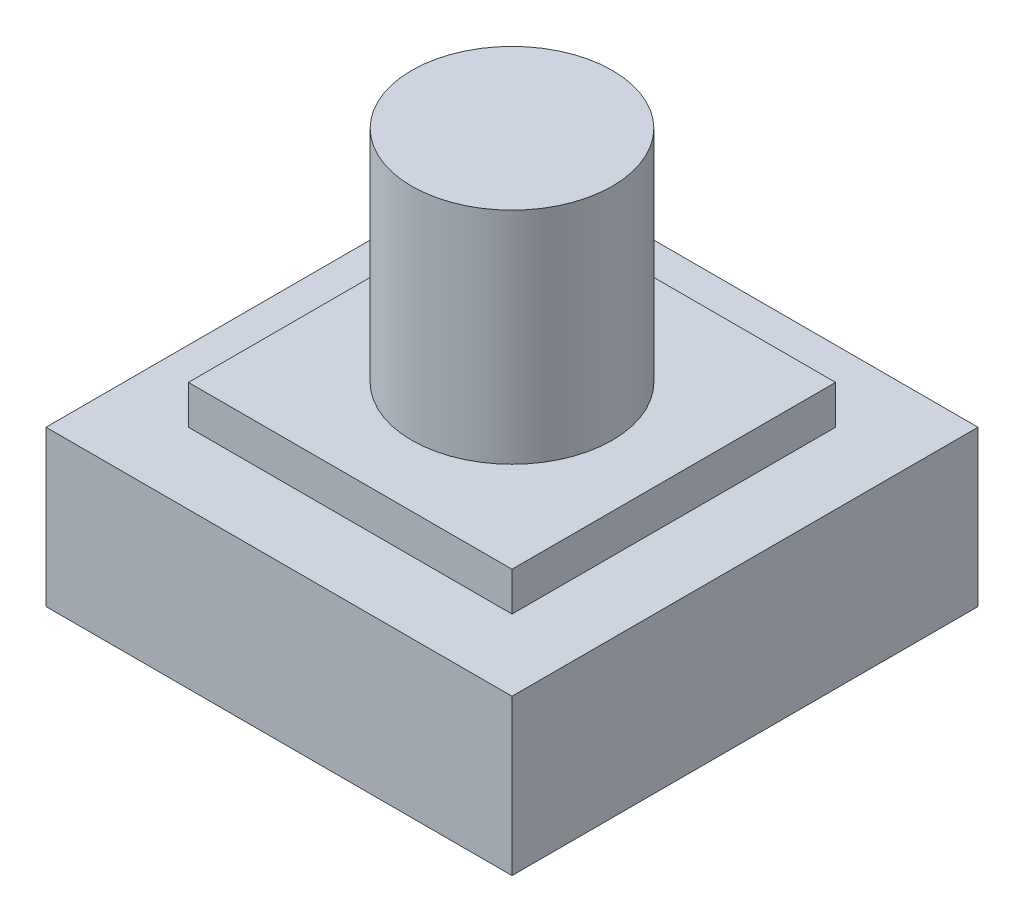
ISO-10303-21;
HEADER;
FILE_DESCRIPTION(('STEP AP214'),'2;1');
FILE_NAME('part.step','',(''),(''),'','','');
FILE_SCHEMA(('AUTOMOTIVE_DESIGN { 1 0 10303 214 1 1 1 1 }'));
ENDSEC;
DATA;
#1=APPLICATION_CONTEXT('core data for automotive mechanical design processes');
#2=APPLICATION_PROTOCOL_DEFINITION('international standard','automotive_design',2000,#1);
#3=PRODUCT_CONTEXT('',#1,'mechanical');
#4=PRODUCT('Part','Part','',(#3));
#5=PRODUCT_RELATED_PRODUCT_CATEGORY('part','',(#4));
#6=PRODUCT_DEFINITION_FORMATION('','',#4);
#7=PRODUCT_DEFINITION_CONTEXT('part definition',#1,'design');
#8=PRODUCT_DEFINITION('design','',#6,#7);
#9=PRODUCT_DEFINITION_SHAPE('','',#8);
#10=(LENGTH_UNIT() NAMED_UNIT(*) SI_UNIT(.MILLI.,.METRE.));
#11=(NAMED_UNIT(*) PLANE_ANGLE_UNIT() SI_UNIT($,.RADIAN.));
#12=(NAMED_UNIT(*) SI_UNIT($,.STERADIAN.) SOLID_ANGLE_UNIT());
#13=UNCERTAINTY_MEASURE_WITH_UNIT(LENGTH_MEASURE(1.E-05),#10,'distance_accuracy_value','');
#14=(GEOMETRIC_REPRESENTATION_CONTEXT(3) GLOBAL_UNCERTAINTY_ASSIGNED_CONTEXT((#13)) GLOBAL_UNIT_ASSIGNED_CONTEXT((#10,
#11,#12)) REPRESENTATION_CONTEXT('',''));
#15=CARTESIAN_POINT('',(0.,0.,0.));
#16=DIRECTION('',(0.,0.,1.));
#17=DIRECTION('',(1.,0.,0.));
#18=AXIS2_PLACEMENT_3D('',#15,#16,#17);
#19=CARTESIAN_POINT('',(0.,32.,0.));
#20=DIRECTION('',(0.,-1.,0.));
#21=DIRECTION('',(0.,0.,-1.));
#22=AXIS2_PLACEMENT_3D('',#19,#20,#21);
#23=CYLINDRICAL_SURFACE('',#22,7.75);
#24=CARTESIAN_POINT('',(0.,32.,0.));
#25=DIRECTION('',(0.,-1.,0.));
#26=DIRECTION('',(0.,0.,-1.));
#27=AXIS2_PLACEMENT_3D('',#24,#25,#26);
#28=CIRCLE('',#27,7.75);
#29=CARTESIAN_POINT('',(0.,32.,-7.75));
#30=VERTEX_POINT('',#29);
#31=EDGE_CURVE('E11',#30,#30,#28,.T.);
#32=ORIENTED_EDGE('',*,*,#31,.T.);
#33=EDGE_LOOP('',(#32));
#34=FACE_BOUND('',#33,.T.);
#35=CARTESIAN_POINT('',(0.,15.,0.));
#36=DIRECTION('',(0.,-1.,0.));
#37=DIRECTION('',(0.,0.,-1.));
#38=AXIS2_PLACEMENT_3D('',#35,#36,#37);
#39=CIRCLE('',#38,7.75);
#40=CARTESIAN_POINT('',(0.,15.,-7.75));
#41=VERTEX_POINT('',#40);
#42=EDGE_CURVE('E43',#41,#41,#39,.T.);
#43=ORIENTED_EDGE('',*,*,#42,.F.);
#44=EDGE_LOOP('',(#43));
#45=FACE_BOUND('',#44,.T.);
#46=ADVANCED_FACE('F40',(#34,#45),#23,.T.);
#47=CARTESIAN_POINT('',(0.,32.,0.));
#48=DIRECTION('',(0.,-1.,0.));
#49=DIRECTION('',(0.,0.,-1.));
#50=AXIS2_PLACEMENT_3D('',#47,#48,#49);
#51=PLANE('',#50);
#52=ORIENTED_EDGE('',*,*,#31,.F.);
#53=EDGE_LOOP('',(#52));
#54=FACE_BOUND('',#53,.T.);
#55=ADVANCED_FACE('F55',(#54),#51,.F.);
#56=CARTESIAN_POINT('',(0.,15.,0.));
#57=DIRECTION('',(0.,-1.,0.));
#58=DIRECTION('',(0.,0.,-1.));
#59=AXIS2_PLACEMENT_3D('',#56,#57,#58);
#60=PLANE('',#59);
#61=ORIENTED_EDGE('',*,*,#42,.T.);
#62=EDGE_LOOP('',(#61));
#63=FACE_BOUND('',#62,.T.);
#64=ADVANCED_FACE('F52',(#63),#60,.T.);
#65=CLOSED_SHELL('',(#46,#55,#64));
#66=MANIFOLD_SOLID_BREP('B2',#65);
#67=CARTESIAN_POINT('',(0.,0.,0.));
#68=DIRECTION('',(0.,1.,0.));
#69=DIRECTION('',(0.,0.,1.));
#70=AXIS2_PLACEMENT_3D('',#67,#68,#69);
#71=PLANE('',#70);
#72=DIRECTION('',(1.,0.,0.));
#73=VECTOR('',#72,1.);
#74=CARTESIAN_POINT('',(0.,0.,18.));
#75=LINE('',#74,#73);
#76=CARTESIAN_POINT('',(-18.,0.,18.));
#77=VERTEX_POINT('',#76);
#78=CARTESIAN_POINT('',(18.,0.,18.));
#79=VERTEX_POINT('',#78);
#80=EDGE_CURVE('E220',#77,#79,#75,.T.);
#81=ORIENTED_EDGE('',*,*,#80,.F.);
#82=DIRECTION('',(0.,0.,-1.));
#83=VECTOR('',#82,1.);
#84=CARTESIAN_POINT('',(-18.,0.,0.));
#85=LINE('',#84,#83);
#86=CARTESIAN_POINT('',(-18.,0.,-18.));
#87=VERTEX_POINT('',#86);
#88=EDGE_CURVE('E233',#77,#87,#85,.T.);
#89=ORIENTED_EDGE('',*,*,#88,.T.);
#90=DIRECTION('',(1.,0.,0.));
#91=VECTOR('',#90,1.);
#92=CARTESIAN_POINT('',(0.,0.,-18.));
#93=LINE('',#92,#91);
#94=CARTESIAN_POINT('',(18.,0.,-18.));
#95=VERTEX_POINT('',#94);
#96=EDGE_CURVE('E247',#87,#95,#93,.T.);
#97=ORIENTED_EDGE('',*,*,#96,.T.);
#98=DIRECTION('',(0.,0.,-1.));
#99=VECTOR('',#98,1.);
#100=CARTESIAN_POINT('',(18.,0.,0.));
#101=LINE('',#100,#99);
#102=EDGE_CURVE('E244',#79,#95,#101,.T.);
#103=ORIENTED_EDGE('',*,*,#102,.F.);
#104=EDGE_LOOP('',(#81,#89,#97,#103));
#105=FACE_BOUND('',#104,.T.);
#106=DIRECTION('',(0.,0.,-1.));
#107=VECTOR('',#106,1.);
#108=CARTESIAN_POINT('',(3.,0.,-11.8));
#109=LINE('',#108,#107);
#110=CARTESIAN_POINT('',(3.,0.,-11.8));
#111=VERTEX_POINT('',#110);
#112=CARTESIAN_POINT('',(3.,0.,-16.5));
#113=VERTEX_POINT('',#112);
#114=EDGE_CURVE('E190',#111,#113,#109,.T.);
#115=ORIENTED_EDGE('',*,*,#114,.F.);
#116=DIRECTION('',(-1.,0.,0.));
#117=VECTOR('',#116,1.);
#118=CARTESIAN_POINT('',(3.,0.,-11.8));
#119=LINE('',#118,#117);
#120=CARTESIAN_POINT('',(12.,0.,-11.8));
#121=VERTEX_POINT('',#120);
#122=EDGE_CURVE('E187',#121,#111,#119,.T.);
#123=ORIENTED_EDGE('',*,*,#122,.F.);
#124=DIRECTION('',(0.,0.,1.));
#125=VECTOR('',#124,1.);
#126=CARTESIAN_POINT('',(12.,0.,-11.8));
#127=LINE('',#126,#125);
#128=CARTESIAN_POINT('',(12.,0.,-16.5));
#129=VERTEX_POINT('',#128);
#130=EDGE_CURVE('E101',#129,#121,#127,.T.);
#131=ORIENTED_EDGE('',*,*,#130,.F.);
#132=DIRECTION('',(1.,0.,0.));
#133=VECTOR('',#132,1.);
#134=CARTESIAN_POINT('',(3.,0.,-16.5));
#135=LINE('',#134,#133);
#136=EDGE_CURVE('E96',#113,#129,#135,.T.);
#137=ORIENTED_EDGE('',*,*,#136,.F.);
#138=EDGE_LOOP('',(#115,#123,#131,#137));
#139=FACE_BOUND('',#138,.T.);
#140=ADVANCED_FACE('F81',(#105,#139),#71,.F.);
#141=CARTESIAN_POINT('',(0.,12.,0.));
#142=DIRECTION('',(0.,1.,0.));
#143=DIRECTION('',(0.,0.,1.));
#144=AXIS2_PLACEMENT_3D('',#141,#142,#143);
#145=PLANE('',#144);
#146=DIRECTION('',(1.,0.,0.));
#147=VECTOR('',#146,1.);
#148=CARTESIAN_POINT('',(0.,12.,18.));
#149=LINE('',#148,#147);
#150=CARTESIAN_POINT('',(-18.,12.,18.));
#151=VERTEX_POINT('',#150);
#152=CARTESIAN_POINT('',(18.,12.,18.));
#153=VERTEX_POINT('',#152);
#154=EDGE_CURVE('E229',#151,#153,#149,.T.);
#155=ORIENTED_EDGE('',*,*,#154,.T.);
#156=DIRECTION('',(0.,0.,-1.));
#157=VECTOR('',#156,1.);
#158=CARTESIAN_POINT('',(18.,12.,0.));
#159=LINE('',#158,#157);
#160=CARTESIAN_POINT('',(18.,12.,-18.));
#161=VERTEX_POINT('',#160);
#162=EDGE_CURVE('E232',#153,#161,#159,.T.);
#163=ORIENTED_EDGE('',*,*,#162,.T.);
#164=DIRECTION('',(1.,0.,0.));
#165=VECTOR('',#164,1.);
#166=CARTESIAN_POINT('',(0.,12.,-18.));
#167=LINE('',#166,#165);
#168=CARTESIAN_POINT('',(-18.,12.,-18.));
#169=VERTEX_POINT('',#168);
#170=EDGE_CURVE('E235',#169,#161,#167,.T.);
#171=ORIENTED_EDGE('',*,*,#170,.F.);
#172=DIRECTION('',(0.,0.,-1.));
#173=VECTOR('',#172,1.);
#174=CARTESIAN_POINT('',(-18.,12.,0.));
#175=LINE('',#174,#173);
#176=EDGE_CURVE('E238',#151,#169,#175,.T.);
#177=ORIENTED_EDGE('',*,*,#176,.F.);
#178=EDGE_LOOP('',(#155,#163,#171,#177));
#179=FACE_BOUND('',#178,.T.);
#180=DIRECTION('',(0.,0.,-1.));
#181=VECTOR('',#180,1.);
#182=CARTESIAN_POINT('',(12.5,12.,0.));
#183=LINE('',#182,#181);
#184=CARTESIAN_POINT('',(12.5,12.,12.5));
#185=VERTEX_POINT('',#184);
#186=CARTESIAN_POINT('',(12.5,12.,-12.5));
#187=VERTEX_POINT('',#186);
#188=EDGE_CURVE('E203',#185,#187,#183,.T.);
#189=ORIENTED_EDGE('',*,*,#188,.F.);
#190=DIRECTION('',(-1.,0.,0.));
#191=VECTOR('',#190,1.);
#192=CARTESIAN_POINT('',(0.,12.,12.5));
#193=LINE('',#192,#191);
#194=CARTESIAN_POINT('',(-12.5,12.,12.5));
#195=VERTEX_POINT('',#194);
#196=EDGE_CURVE('E191',#185,#195,#193,.T.);
#197=ORIENTED_EDGE('',*,*,#196,.T.);
#198=DIRECTION('',(0.,0.,-1.));
#199=VECTOR('',#198,1.);
#200=CARTESIAN_POINT('',(-12.5,12.,0.));
#201=LINE('',#200,#199);
#202=CARTESIAN_POINT('',(-12.5,12.,-12.5));
#203=VERTEX_POINT('',#202);
#204=EDGE_CURVE('E193',#195,#203,#201,.T.);
#205=ORIENTED_EDGE('',*,*,#204,.T.);
#206=DIRECTION('',(-1.,0.,0.));
#207=VECTOR('',#206,1.);
#208=CARTESIAN_POINT('',(0.,12.,-12.5));
#209=LINE('',#208,#207);
#210=EDGE_CURVE('E212',#187,#203,#209,.T.);
#211=ORIENTED_EDGE('',*,*,#210,.F.);
#212=EDGE_LOOP('',(#189,#197,#205,#211));
#213=FACE_BOUND('',#212,.T.);
#214=ADVANCED_FACE('F270',(#179,#213),#145,.T.);
#215=CARTESIAN_POINT('',(0.,12.,18.));
#216=DIRECTION('',(0.,0.,-1.));
#217=DIRECTION('',(-1.,0.,0.));
#218=AXIS2_PLACEMENT_3D('',#215,#216,#217);
#219=PLANE('',#218);
#220=ORIENTED_EDGE('',*,*,#80,.T.);
#221=DIRECTION('',(0.,-1.,0.));
#222=VECTOR('',#221,1.);
#223=CARTESIAN_POINT('',(18.,12.,18.));
#224=LINE('',#223,#222);
#225=EDGE_CURVE('E38',#153,#79,#224,.T.);
#226=ORIENTED_EDGE('',*,*,#225,.F.);
#227=ORIENTED_EDGE('',*,*,#154,.F.);
#228=DIRECTION('',(0.,-1.,0.));
#229=VECTOR('',#228,1.);
#230=CARTESIAN_POINT('',(-18.,12.,18.));
#231=LINE('',#230,#229);
#232=EDGE_CURVE('E241',#151,#77,#231,.T.);
#233=ORIENTED_EDGE('',*,*,#232,.T.);
#234=EDGE_LOOP('',(#220,#226,#227,#233));
#235=FACE_BOUND('',#234,.T.);
#236=ADVANCED_FACE('F83',(#235),#219,.F.);
#237=CARTESIAN_POINT('',(18.,12.,0.));
#238=DIRECTION('',(-1.,0.,0.));
#239=DIRECTION('',(0.,0.,1.));
#240=AXIS2_PLACEMENT_3D('',#237,#238,#239);
#241=PLANE('',#240);
#242=ORIENTED_EDGE('',*,*,#102,.T.);
#243=DIRECTION('',(0.,-1.,0.));
#244=VECTOR('',#243,1.);
#245=CARTESIAN_POINT('',(18.,12.,-18.));
#246=LINE('',#245,#244);
#247=EDGE_CURVE('E89',#161,#95,#246,.T.);
#248=ORIENTED_EDGE('',*,*,#247,.F.);
#249=ORIENTED_EDGE('',*,*,#162,.F.);
#250=ORIENTED_EDGE('',*,*,#225,.T.);
#251=EDGE_LOOP('',(#242,#248,#249,#250));
#252=FACE_BOUND('',#251,.T.);
#253=ADVANCED_FACE('F260',(#252),#241,.F.);
#254=CARTESIAN_POINT('',(0.,12.,-18.));
#255=DIRECTION('',(0.,0.,-1.));
#256=DIRECTION('',(-1.,0.,0.));
#257=AXIS2_PLACEMENT_3D('',#254,#255,#256);
#258=PLANE('',#257);
#259=ORIENTED_EDGE('',*,*,#96,.F.);
#260=DIRECTION('',(0.,-1.,0.));
#261=VECTOR('',#260,1.);
#262=CARTESIAN_POINT('',(-18.,12.,-18.));
#263=LINE('',#262,#261);
#264=EDGE_CURVE('E253',#169,#87,#263,.T.);
#265=ORIENTED_EDGE('',*,*,#264,.F.);
#266=ORIENTED_EDGE('',*,*,#170,.T.);
#267=ORIENTED_EDGE('',*,*,#247,.T.);
#268=EDGE_LOOP('',(#259,#265,#266,#267));
#269=FACE_BOUND('',#268,.T.);
#270=ADVANCED_FACE('F257',(#269),#258,.T.);
#271=CARTESIAN_POINT('',(-18.,12.,0.));
#272=DIRECTION('',(-1.,0.,0.));
#273=DIRECTION('',(0.,0.,1.));
#274=AXIS2_PLACEMENT_3D('',#271,#272,#273);
#275=PLANE('',#274);
#276=ORIENTED_EDGE('',*,*,#88,.F.);
#277=ORIENTED_EDGE('',*,*,#232,.F.);
#278=ORIENTED_EDGE('',*,*,#176,.T.);
#279=ORIENTED_EDGE('',*,*,#264,.T.);
#280=EDGE_LOOP('',(#276,#277,#278,#279));
#281=FACE_BOUND('',#280,.T.);
#282=ADVANCED_FACE('F266',(#281),#275,.T.);
#283=CARTESIAN_POINT('',(0.,15.,12.5));
#284=DIRECTION('',(0.,0.,1.));
#285=DIRECTION('',(1.,0.,0.));
#286=AXIS2_PLACEMENT_3D('',#283,#284,#285);
#287=PLANE('',#286);
#288=ORIENTED_EDGE('',*,*,#196,.F.);
#289=DIRECTION('',(0.,-1.,0.));
#290=VECTOR('',#289,1.);
#291=CARTESIAN_POINT('',(12.5,15.,12.5));
#292=LINE('',#291,#290);
#293=CARTESIAN_POINT('',(12.5,15.,12.5));
#294=VERTEX_POINT('',#293);
#295=EDGE_CURVE('E217',#294,#185,#292,.T.);
#296=ORIENTED_EDGE('',*,*,#295,.F.);
#297=DIRECTION('',(-1.,0.,0.));
#298=VECTOR('',#297,1.);
#299=CARTESIAN_POINT('',(0.,15.,12.5));
#300=LINE('',#299,#298);
#301=CARTESIAN_POINT('',(-12.5,15.,12.5));
#302=VERTEX_POINT('',#301);
#303=EDGE_CURVE('E199',#294,#302,#300,.T.);
#304=ORIENTED_EDGE('',*,*,#303,.T.);
#305=DIRECTION('',(0.,-1.,0.));
#306=VECTOR('',#305,1.);
#307=CARTESIAN_POINT('',(-12.5,15.,12.5));
#308=LINE('',#307,#306);
#309=EDGE_CURVE('E209',#302,#195,#308,.T.);
#310=ORIENTED_EDGE('',*,*,#309,.T.);
#311=EDGE_LOOP('',(#288,#296,#304,#310));
#312=FACE_BOUND('',#311,.T.);
#313=ADVANCED_FACE('F289',(#312),#287,.T.);
#314=CARTESIAN_POINT('',(12.5,15.,0.));
#315=DIRECTION('',(-1.,0.,0.));
#316=DIRECTION('',(0.,0.,1.));
#317=AXIS2_PLACEMENT_3D('',#314,#315,#316);
#318=PLANE('',#317);
#319=ORIENTED_EDGE('',*,*,#188,.T.);
#320=DIRECTION('',(0.,-1.,0.));
#321=VECTOR('',#320,1.);
#322=CARTESIAN_POINT('',(12.5,15.,-12.5));
#323=LINE('',#322,#321);
#324=CARTESIAN_POINT('',(12.5,15.,-12.5));
#325=VERTEX_POINT('',#324);
#326=EDGE_CURVE('E221',#325,#187,#323,.T.);
#327=ORIENTED_EDGE('',*,*,#326,.F.);
#328=DIRECTION('',(0.,0.,-1.));
#329=VECTOR('',#328,1.);
#330=CARTESIAN_POINT('',(12.5,15.,0.));
#331=LINE('',#330,#329);
#332=EDGE_CURVE('E208',#294,#325,#331,.T.);
#333=ORIENTED_EDGE('',*,*,#332,.F.);
#334=ORIENTED_EDGE('',*,*,#295,.T.);
#335=EDGE_LOOP('',(#319,#327,#333,#334));
#336=FACE_BOUND('',#335,.T.);
#337=ADVANCED_FACE('F306',(#336),#318,.F.);
#338=CARTESIAN_POINT('',(0.,15.,-12.5));
#339=DIRECTION('',(0.,0.,1.));
#340=DIRECTION('',(1.,0.,0.));
#341=AXIS2_PLACEMENT_3D('',#338,#339,#340);
#342=PLANE('',#341);
#343=ORIENTED_EDGE('',*,*,#210,.T.);
#344=DIRECTION('',(0.,-1.,0.));
#345=VECTOR('',#344,1.);
#346=CARTESIAN_POINT('',(-12.5,15.,-12.5));
#347=LINE('',#346,#345);
#348=CARTESIAN_POINT('',(-12.5,15.,-12.5));
#349=VERTEX_POINT('',#348);
#350=EDGE_CURVE('E224',#349,#203,#347,.T.);
#351=ORIENTED_EDGE('',*,*,#350,.F.);
#352=DIRECTION('',(-1.,0.,0.));
#353=VECTOR('',#352,1.);
#354=CARTESIAN_POINT('',(0.,15.,-12.5));
#355=LINE('',#354,#353);
#356=EDGE_CURVE('E206',#325,#349,#355,.T.);
#357=ORIENTED_EDGE('',*,*,#356,.F.);
#358=ORIENTED_EDGE('',*,*,#326,.T.);
#359=EDGE_LOOP('',(#343,#351,#357,#358));
#360=FACE_BOUND('',#359,.T.);
#361=ADVANCED_FACE('F313',(#360),#342,.F.);
#362=CARTESIAN_POINT('',(-12.5,15.,0.));
#363=DIRECTION('',(-1.,0.,0.));
#364=DIRECTION('',(0.,0.,1.));
#365=AXIS2_PLACEMENT_3D('',#362,#363,#364);
#366=PLANE('',#365);
#367=ORIENTED_EDGE('',*,*,#204,.F.);
#368=ORIENTED_EDGE('',*,*,#309,.F.);
#369=DIRECTION('',(0.,0.,-1.));
#370=VECTOR('',#369,1.);
#371=CARTESIAN_POINT('',(-12.5,15.,0.));
#372=LINE('',#371,#370);
#373=EDGE_CURVE('E202',#302,#349,#372,.T.);
#374=ORIENTED_EDGE('',*,*,#373,.T.);
#375=ORIENTED_EDGE('',*,*,#350,.T.);
#376=EDGE_LOOP('',(#367,#368,#374,#375));
#377=FACE_BOUND('',#376,.T.);
#378=ADVANCED_FACE('F321',(#377),#366,.T.);
#379=CARTESIAN_POINT('',(0.,15.,0.));
#380=DIRECTION('',(0.,-1.,0.));
#381=DIRECTION('',(0.,0.,-1.));
#382=AXIS2_PLACEMENT_3D('',#379,#380,#381);
#383=PLANE('',#382);
#384=ORIENTED_EDGE('',*,*,#303,.F.);
#385=ORIENTED_EDGE('',*,*,#332,.T.);
#386=ORIENTED_EDGE('',*,*,#356,.T.);
#387=ORIENTED_EDGE('',*,*,#373,.F.);
#388=EDGE_LOOP('',(#384,#385,#386,#387));
#389=FACE_BOUND('',#388,.T.);
#390=ADVANCED_FACE('F329',(#389),#383,.F.);
#391=CARTESIAN_POINT('',(3.,-2.,-11.8));
#392=DIRECTION('',(1.,0.,0.));
#393=DIRECTION('',(0.,0.,-1.));
#394=AXIS2_PLACEMENT_3D('',#391,#392,#393);
#395=PLANE('',#394);
#396=ORIENTED_EDGE('',*,*,#114,.T.);
#397=DIRECTION('',(0.,1.,0.));
#398=VECTOR('',#397,1.);
#399=CARTESIAN_POINT('',(3.,-2.,-16.5));
#400=LINE('',#399,#398);
#401=CARTESIAN_POINT('',(3.,-2.,-16.5));
#402=VERTEX_POINT('',#401);
#403=EDGE_CURVE('E171',#402,#113,#400,.T.);
#404=ORIENTED_EDGE('',*,*,#403,.F.);
#405=DIRECTION('',(0.,0.,-1.));
#406=VECTOR('',#405,1.);
#407=CARTESIAN_POINT('',(3.,-2.,-11.8));
#408=LINE('',#407,#406);
#409=CARTESIAN_POINT('',(3.,-2.,-11.8));
#410=VERTEX_POINT('',#409);
#411=EDGE_CURVE('E178',#410,#402,#408,.T.);
#412=ORIENTED_EDGE('',*,*,#411,.F.);
#413=DIRECTION('',(0.,1.,0.));
#414=VECTOR('',#413,1.);
#415=CARTESIAN_POINT('',(3.,-2.,-11.8));
#416=LINE('',#415,#414);
#417=EDGE_CURVE('E388',#410,#111,#416,.T.);
#418=ORIENTED_EDGE('',*,*,#417,.T.);
#419=EDGE_LOOP('',(#396,#404,#412,#418));
#420=FACE_BOUND('',#419,.T.);
#421=ADVANCED_FACE('F189',(#420),#395,.F.);
#422=CARTESIAN_POINT('',(3.,-2.,-16.5));
#423=DIRECTION('',(0.,0.,1.));
#424=DIRECTION('',(1.,0.,0.));
#425=AXIS2_PLACEMENT_3D('',#422,#423,#424);
#426=PLANE('',#425);
#427=ORIENTED_EDGE('',*,*,#136,.T.);
#428=DIRECTION('',(0.,1.,0.));
#429=VECTOR('',#428,1.);
#430=CARTESIAN_POINT('',(12.,-2.,-16.5));
#431=LINE('',#430,#429);
#432=CARTESIAN_POINT('',(12.,-2.,-16.5));
#433=VERTEX_POINT('',#432);
#434=EDGE_CURVE('E174',#433,#129,#431,.T.);
#435=ORIENTED_EDGE('',*,*,#434,.F.);
#436=DIRECTION('',(1.,0.,0.));
#437=VECTOR('',#436,1.);
#438=CARTESIAN_POINT('',(3.,-2.,-16.5));
#439=LINE('',#438,#437);
#440=EDGE_CURVE('E167',#402,#433,#439,.T.);
#441=ORIENTED_EDGE('',*,*,#440,.F.);
#442=ORIENTED_EDGE('',*,*,#403,.T.);
#443=EDGE_LOOP('',(#427,#435,#441,#442));
#444=FACE_BOUND('',#443,.T.);
#445=ADVANCED_FACE('F169',(#444),#426,.F.);
#446=CARTESIAN_POINT('',(12.,-2.,-11.8));
#447=DIRECTION('',(-1.,0.,0.));
#448=DIRECTION('',(0.,0.,1.));
#449=AXIS2_PLACEMENT_3D('',#446,#447,#448);
#450=PLANE('',#449);
#451=ORIENTED_EDGE('',*,*,#130,.T.);
#452=DIRECTION('',(0.,1.,0.));
#453=VECTOR('',#452,1.);
#454=CARTESIAN_POINT('',(12.,-2.,-11.8));
#455=LINE('',#454,#453);
#456=CARTESIAN_POINT('',(12.,-2.,-11.8));
#457=VERTEX_POINT('',#456);
#458=EDGE_CURVE('E195',#457,#121,#455,.T.);
#459=ORIENTED_EDGE('',*,*,#458,.F.);
#460=DIRECTION('',(0.,0.,1.));
#461=VECTOR('',#460,1.);
#462=CARTESIAN_POINT('',(12.,-2.,-11.8));
#463=LINE('',#462,#461);
#464=EDGE_CURVE('E177',#433,#457,#463,.T.);
#465=ORIENTED_EDGE('',*,*,#464,.F.);
#466=ORIENTED_EDGE('',*,*,#434,.T.);
#467=EDGE_LOOP('',(#451,#459,#465,#466));
#468=FACE_BOUND('',#467,.T.);
#469=ADVANCED_FACE('F352',(#468),#450,.F.);
#470=CARTESIAN_POINT('',(3.,-2.,-11.8));
#471=DIRECTION('',(0.,0.,-1.));
#472=DIRECTION('',(-1.,0.,0.));
#473=AXIS2_PLACEMENT_3D('',#470,#471,#472);
#474=PLANE('',#473);
#475=ORIENTED_EDGE('',*,*,#122,.T.);
#476=ORIENTED_EDGE('',*,*,#417,.F.);
#477=DIRECTION('',(-1.,0.,0.));
#478=VECTOR('',#477,1.);
#479=CARTESIAN_POINT('',(3.,-2.,-11.8));
#480=LINE('',#479,#478);
#481=EDGE_CURVE('E183',#457,#410,#480,.T.);
#482=ORIENTED_EDGE('',*,*,#481,.F.);
#483=ORIENTED_EDGE('',*,*,#458,.T.);
#484=EDGE_LOOP('',(#475,#476,#482,#483));
#485=FACE_BOUND('',#484,.T.);
#486=ADVANCED_FACE('F359',(#485),#474,.F.);
#487=CARTESIAN_POINT('',(0.,-2.,0.));
#488=DIRECTION('',(0.,-1.,0.));
#489=DIRECTION('',(0.,0.,-1.));
#490=AXIS2_PLACEMENT_3D('',#487,#488,#489);
#491=PLANE('',#490);
#492=ORIENTED_EDGE('',*,*,#411,.T.);
#493=ORIENTED_EDGE('',*,*,#440,.T.);
#494=ORIENTED_EDGE('',*,*,#464,.T.);
#495=ORIENTED_EDGE('',*,*,#481,.T.);
#496=EDGE_LOOP('',(#492,#493,#494,#495));
#497=FACE_BOUND('',#496,.T.);
#498=ADVANCED_FACE('F181',(#497),#491,.T.);
#499=CLOSED_SHELL('',(#140,#214,#236,#253,#270,#282,#313,#337,#361,#378,#390,#421,#445,#469,
#486,#498));
#500=MANIFOLD_SOLID_BREP('B6',#499);
#501=ADVANCED_BREP_SHAPE_REPRESENTATION('',(#18,#66,#500),#14);
#502=SHAPE_DEFINITION_REPRESENTATION(#9,#501);
ENDSEC;
END-ISO-10303-21;
